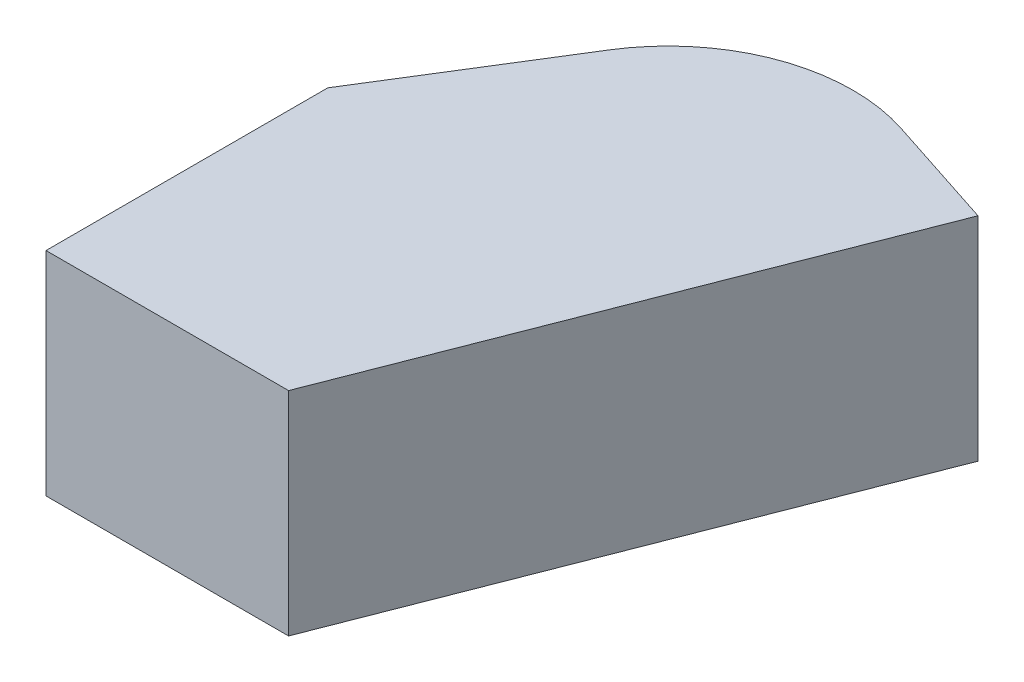
ISO-10303-21;
HEADER;
FILE_DESCRIPTION(('STEP AP214'),'2;1');
FILE_NAME('part.step','',(''),(''),'','','');
FILE_SCHEMA(('AUTOMOTIVE_DESIGN { 1 0 10303 214 1 1 1 1 }'));
ENDSEC;
DATA;
#1=APPLICATION_CONTEXT('core data for automotive mechanical design processes');
#2=APPLICATION_PROTOCOL_DEFINITION('international standard','automotive_design',2000,#1);
#3=PRODUCT_CONTEXT('',#1,'mechanical');
#4=PRODUCT('Part','Part','',(#3));
#5=PRODUCT_RELATED_PRODUCT_CATEGORY('part','',(#4));
#6=PRODUCT_DEFINITION_FORMATION('','',#4);
#7=PRODUCT_DEFINITION_CONTEXT('part definition',#1,'design');
#8=PRODUCT_DEFINITION('design','',#6,#7);
#9=PRODUCT_DEFINITION_SHAPE('','',#8);
#10=(LENGTH_UNIT() NAMED_UNIT(*) SI_UNIT(.MILLI.,.METRE.));
#11=(NAMED_UNIT(*) PLANE_ANGLE_UNIT() SI_UNIT($,.RADIAN.));
#12=(NAMED_UNIT(*) SI_UNIT($,.STERADIAN.) SOLID_ANGLE_UNIT());
#13=UNCERTAINTY_MEASURE_WITH_UNIT(LENGTH_MEASURE(1.E-05),#10,'distance_accuracy_value','');
#14=(GEOMETRIC_REPRESENTATION_CONTEXT(3) GLOBAL_UNCERTAINTY_ASSIGNED_CONTEXT((#13)) GLOBAL_UNIT_ASSIGNED_CONTEXT((#10,
#11,#12)) REPRESENTATION_CONTEXT('',''));
#15=CARTESIAN_POINT('',(0.,0.,0.));
#16=DIRECTION('',(0.,0.,1.));
#17=DIRECTION('',(1.,0.,0.));
#18=AXIS2_PLACEMENT_3D('',#15,#16,#17);
#19=CARTESIAN_POINT('',(-66.6737685117542,58.42,0.));
#20=DIRECTION('',(1.,0.,0.));
#21=DIRECTION('',(0.,0.,-1.));
#22=AXIS2_PLACEMENT_3D('',#19,#20,#21);
#23=PLANE('',#22);
#24=DIRECTION('',(0.,0.,1.));
#25=VECTOR('',#24,1.);
#26=CARTESIAN_POINT('',(-66.6737685117542,0.,0.));
#27=LINE('',#26,#25);
#28=CARTESIAN_POINT('',(-66.6737685117542,0.,0.));
#29=VERTEX_POINT('',#28);
#30=CARTESIAN_POINT('',(-66.6737685117542,0.,77.4518589102709));
#31=VERTEX_POINT('',#30);
#32=EDGE_CURVE('E122',#29,#31,#27,.T.);
#33=ORIENTED_EDGE('',*,*,#32,.T.);
#34=DIRECTION('',(0.,-1.,0.));
#35=VECTOR('',#34,1.);
#36=CARTESIAN_POINT('',(-66.6737685117542,58.42,77.4518589102709));
#37=LINE('',#36,#35);
#38=CARTESIAN_POINT('',(-66.6737685117542,58.42,77.4518589102709));
#39=VERTEX_POINT('',#38);
#40=EDGE_CURVE('E11',#39,#31,#37,.T.);
#41=ORIENTED_EDGE('',*,*,#40,.F.);
#42=DIRECTION('',(0.,0.,1.));
#43=VECTOR('',#42,1.);
#44=CARTESIAN_POINT('',(-66.6737685117542,58.42,0.));
#45=LINE('',#44,#43);
#46=CARTESIAN_POINT('',(-66.6737685117542,58.42,0.));
#47=VERTEX_POINT('',#46);
#48=EDGE_CURVE('E132',#47,#39,#45,.T.);
#49=ORIENTED_EDGE('',*,*,#48,.F.);
#50=DIRECTION('',(0.,-1.,0.));
#51=VECTOR('',#50,1.);
#52=CARTESIAN_POINT('',(-66.6737685117542,58.42,0.));
#53=LINE('',#52,#51);
#54=EDGE_CURVE('E118',#47,#29,#53,.T.);
#55=ORIENTED_EDGE('',*,*,#54,.T.);
#56=EDGE_LOOP('',(#33,#41,#49,#55));
#57=FACE_BOUND('',#56,.T.);
#58=ADVANCED_FACE('F38',(#57),#23,.F.);
#59=CARTESIAN_POINT('',(0.,58.42,77.4518589102709));
#60=DIRECTION('',(0.,0.,-1.));
#61=DIRECTION('',(-1.,0.,0.));
#62=AXIS2_PLACEMENT_3D('',#59,#60,#61);
#63=PLANE('',#62);
#64=DIRECTION('',(1.,0.,0.));
#65=VECTOR('',#64,1.);
#66=CARTESIAN_POINT('',(0.,0.,77.4518589102709));
#67=LINE('',#66,#65);
#68=CARTESIAN_POINT('',(0.,0.,77.4518589102709));
#69=VERTEX_POINT('',#68);
#70=EDGE_CURVE('E125',#31,#69,#67,.T.);
#71=ORIENTED_EDGE('',*,*,#70,.T.);
#72=DIRECTION('',(0.,-1.,0.));
#73=VECTOR('',#72,1.);
#74=CARTESIAN_POINT('',(0.,58.42,77.4518589102709));
#75=LINE('',#74,#73);
#76=CARTESIAN_POINT('',(0.,58.42,77.4518589102709));
#77=VERTEX_POINT('',#76);
#78=EDGE_CURVE('E46',#77,#69,#75,.T.);
#79=ORIENTED_EDGE('',*,*,#78,.F.);
#80=DIRECTION('',(1.,0.,0.));
#81=VECTOR('',#80,1.);
#82=CARTESIAN_POINT('',(0.,58.42,77.4518589102709));
#83=LINE('',#82,#81);
#84=EDGE_CURVE('E91',#39,#77,#83,.T.);
#85=ORIENTED_EDGE('',*,*,#84,.F.);
#86=ORIENTED_EDGE('',*,*,#40,.T.);
#87=EDGE_LOOP('',(#71,#79,#85,#86));
#88=FACE_BOUND('',#87,.T.);
#89=ADVANCED_FACE('F156',(#88),#63,.F.);
#90=CARTESIAN_POINT('',(53.1384921973379,58.42,-58.9035172942189));
#91=DIRECTION('',(-0.93174729177176,0.,-0.363107400469877));
#92=DIRECTION('',(-0.363107400469877,0.,0.93174729177176));
#93=AXIS2_PLACEMENT_3D('',#90,#91,#92);
#94=PLANE('',#93);
#95=DIRECTION('',(0.363107400469877,0.,-0.93174729177176));
#96=VECTOR('',#95,1.);
#97=CARTESIAN_POINT('',(53.1384921973379,0.,-58.9035172942189));
#98=LINE('',#97,#96);
#99=CARTESIAN_POINT('',(53.1384921973379,0.,-58.9035172942189));
#100=VERTEX_POINT('',#99);
#101=EDGE_CURVE('E127',#69,#100,#98,.T.);
#102=ORIENTED_EDGE('',*,*,#101,.T.);
#103=DIRECTION('',(0.,-1.,0.));
#104=VECTOR('',#103,1.);
#105=CARTESIAN_POINT('',(53.1384921973379,58.42,-58.9035172942189));
#106=LINE('',#105,#104);
#107=CARTESIAN_POINT('',(53.1384921973379,58.42,-58.9035172942189));
#108=VERTEX_POINT('',#107);
#109=EDGE_CURVE('E113',#108,#100,#106,.T.);
#110=ORIENTED_EDGE('',*,*,#109,.F.);
#111=DIRECTION('',(0.363107400469877,0.,-0.93174729177176));
#112=VECTOR('',#111,1.);
#113=CARTESIAN_POINT('',(53.1384921973379,58.42,-58.9035172942189));
#114=LINE('',#113,#112);
#115=EDGE_CURVE('E104',#77,#108,#114,.T.);
#116=ORIENTED_EDGE('',*,*,#115,.F.);
#117=ORIENTED_EDGE('',*,*,#78,.T.);
#118=EDGE_LOOP('',(#102,#110,#116,#117));
#119=FACE_BOUND('',#118,.T.);
#120=ADVANCED_FACE('F138',(#119),#94,.F.);
#121=CARTESIAN_POINT('',(21.8265277700403,58.42,-69.1139404770334));
#122=DIRECTION('',(-0.310020599830917,0.,0.950729839481479));
#123=DIRECTION('',(0.950729839481479,0.,0.310020599830917));
#124=AXIS2_PLACEMENT_3D('',#121,#122,#123);
#125=PLANE('',#124);
#126=DIRECTION('',(-0.950729839481479,0.,-0.310020599830917));
#127=VECTOR('',#126,1.);
#128=CARTESIAN_POINT('',(21.8265277700403,0.,-69.1139404770334));
#129=LINE('',#128,#127);
#130=CARTESIAN_POINT('',(21.8265277700403,0.,-69.1139404770334));
#131=VERTEX_POINT('',#130);
#132=EDGE_CURVE('E112',#100,#131,#129,.T.);
#133=ORIENTED_EDGE('',*,*,#132,.T.);
#134=DIRECTION('',(0.,-1.,0.));
#135=VECTOR('',#134,1.);
#136=CARTESIAN_POINT('',(21.8265277700403,58.42,-69.1139404770334));
#137=LINE('',#136,#135);
#138=CARTESIAN_POINT('',(21.8265277700403,58.42,-69.1139404770334));
#139=VERTEX_POINT('',#138);
#140=EDGE_CURVE('E109',#139,#131,#137,.T.);
#141=ORIENTED_EDGE('',*,*,#140,.F.);
#142=DIRECTION('',(-0.950729839481479,0.,-0.310020599830917));
#143=VECTOR('',#142,1.);
#144=CARTESIAN_POINT('',(21.8265277700403,58.42,-69.1139404770334));
#145=LINE('',#144,#143);
#146=EDGE_CURVE('E98',#108,#139,#145,.T.);
#147=ORIENTED_EDGE('',*,*,#146,.F.);
#148=ORIENTED_EDGE('',*,*,#109,.T.);
#149=EDGE_LOOP('',(#133,#141,#147,#148));
#150=FACE_BOUND('',#149,.T.);
#151=ADVANCED_FACE('F110',(#150),#125,.F.);
#152=CARTESIAN_POINT('',(6.07748129862949,58.42,-20.8168646313743));
#153=DIRECTION('',(0.,-1.,0.));
#154=DIRECTION('',(0.,0.,-1.));
#155=AXIS2_PLACEMENT_3D('',#152,#153,#154);
#156=CYLINDRICAL_SURFACE('',#155,50.8);
#157=CARTESIAN_POINT('',(6.07748129862949,0.,-20.8168646313743));
#158=DIRECTION('',(0.,1.,0.));
#159=DIRECTION('',(0.,0.,-1.));
#160=AXIS2_PLACEMENT_3D('',#157,#158,#159);
#161=CIRCLE('',#160,50.8);
#162=CARTESIAN_POINT('',(-37.0678218733656,0.,-47.6333299875063));
#163=VERTEX_POINT('',#162);
#164=EDGE_CURVE('E77',#131,#163,#161,.T.);
#165=ORIENTED_EDGE('',*,*,#164,.T.);
#166=DIRECTION('',(0.,-1.,0.));
#167=VECTOR('',#166,1.);
#168=CARTESIAN_POINT('',(-37.0678218733656,58.42,-47.6333299875063));
#169=LINE('',#168,#167);
#170=CARTESIAN_POINT('',(-37.0678218733656,58.42,-47.6333299875063));
#171=VERTEX_POINT('',#170);
#172=EDGE_CURVE('E114',#171,#163,#169,.T.);
#173=ORIENTED_EDGE('',*,*,#172,.F.);
#174=CARTESIAN_POINT('',(6.07748129862949,58.42,-20.8168646313743));
#175=DIRECTION('',(0.,1.,0.));
#176=DIRECTION('',(0.,0.,-1.));
#177=AXIS2_PLACEMENT_3D('',#174,#175,#176);
#178=CIRCLE('',#177,50.8);
#179=EDGE_CURVE('E102',#139,#171,#178,.T.);
#180=ORIENTED_EDGE('',*,*,#179,.F.);
#181=ORIENTED_EDGE('',*,*,#140,.T.);
#182=EDGE_LOOP('',(#165,#173,#180,#181));
#183=FACE_BOUND('',#182,.T.);
#184=ADVANCED_FACE('F116',(#183),#156,.T.);
#185=CARTESIAN_POINT('',(-66.6737685117542,58.42,0.));
#186=DIRECTION('',(0.849316991574704,0.,0.527883176301816));
#187=DIRECTION('',(0.527883176301816,0.,-0.849316991574704));
#188=AXIS2_PLACEMENT_3D('',#185,#186,#187);
#189=PLANE('',#188);
#190=DIRECTION('',(-0.527883176301816,0.,0.849316991574704));
#191=VECTOR('',#190,1.);
#192=CARTESIAN_POINT('',(-66.6737685117542,0.,0.));
#193=LINE('',#192,#191);
#194=EDGE_CURVE('E83',#163,#29,#193,.T.);
#195=ORIENTED_EDGE('',*,*,#194,.T.);
#196=ORIENTED_EDGE('',*,*,#54,.F.);
#197=DIRECTION('',(-0.527883176301816,0.,0.849316991574704));
#198=VECTOR('',#197,1.);
#199=CARTESIAN_POINT('',(-66.6737685117542,58.42,0.));
#200=LINE('',#199,#198);
#201=EDGE_CURVE('E54',#171,#47,#200,.T.);
#202=ORIENTED_EDGE('',*,*,#201,.F.);
#203=ORIENTED_EDGE('',*,*,#172,.T.);
#204=EDGE_LOOP('',(#195,#196,#202,#203));
#205=FACE_BOUND('',#204,.T.);
#206=ADVANCED_FACE('F145',(#205),#189,.F.);
#207=CARTESIAN_POINT('',(6.07748129862949,58.42,-20.8168646313743));
#208=DIRECTION('',(0.,-1.,0.));
#209=DIRECTION('',(0.,0.,-1.));
#210=AXIS2_PLACEMENT_3D('',#207,#208,#209);
#211=PLANE('',#210);
#212=ORIENTED_EDGE('',*,*,#48,.T.);
#213=ORIENTED_EDGE('',*,*,#84,.T.);
#214=ORIENTED_EDGE('',*,*,#115,.T.);
#215=ORIENTED_EDGE('',*,*,#146,.T.);
#216=ORIENTED_EDGE('',*,*,#179,.T.);
#217=ORIENTED_EDGE('',*,*,#201,.T.);
#218=EDGE_LOOP('',(#212,#213,#214,#215,#216,#217));
#219=FACE_BOUND('',#218,.T.);
#220=ADVANCED_FACE('F100',(#219),#211,.F.);
#221=CARTESIAN_POINT('',(6.07748129862949,0.,-20.8168646313743));
#222=DIRECTION('',(0.,-1.,0.));
#223=DIRECTION('',(0.,0.,-1.));
#224=AXIS2_PLACEMENT_3D('',#221,#222,#223);
#225=PLANE('',#224);
#226=ORIENTED_EDGE('',*,*,#32,.F.);
#227=ORIENTED_EDGE('',*,*,#194,.F.);
#228=ORIENTED_EDGE('',*,*,#164,.F.);
#229=ORIENTED_EDGE('',*,*,#132,.F.);
#230=ORIENTED_EDGE('',*,*,#101,.F.);
#231=ORIENTED_EDGE('',*,*,#70,.F.);
#232=EDGE_LOOP('',(#226,#227,#228,#229,#230,#231));
#233=FACE_BOUND('',#232,.T.);
#234=ADVANCED_FACE('F141',(#233),#225,.T.);
#235=CLOSED_SHELL('',(#58,#89,#120,#151,#184,#206,#220,#234));
#236=MANIFOLD_SOLID_BREP('B2',#235);
#237=ADVANCED_BREP_SHAPE_REPRESENTATION('',(#18,#236),#14);
#238=SHAPE_DEFINITION_REPRESENTATION(#9,#237);
ENDSEC;
END-ISO-10303-21;
